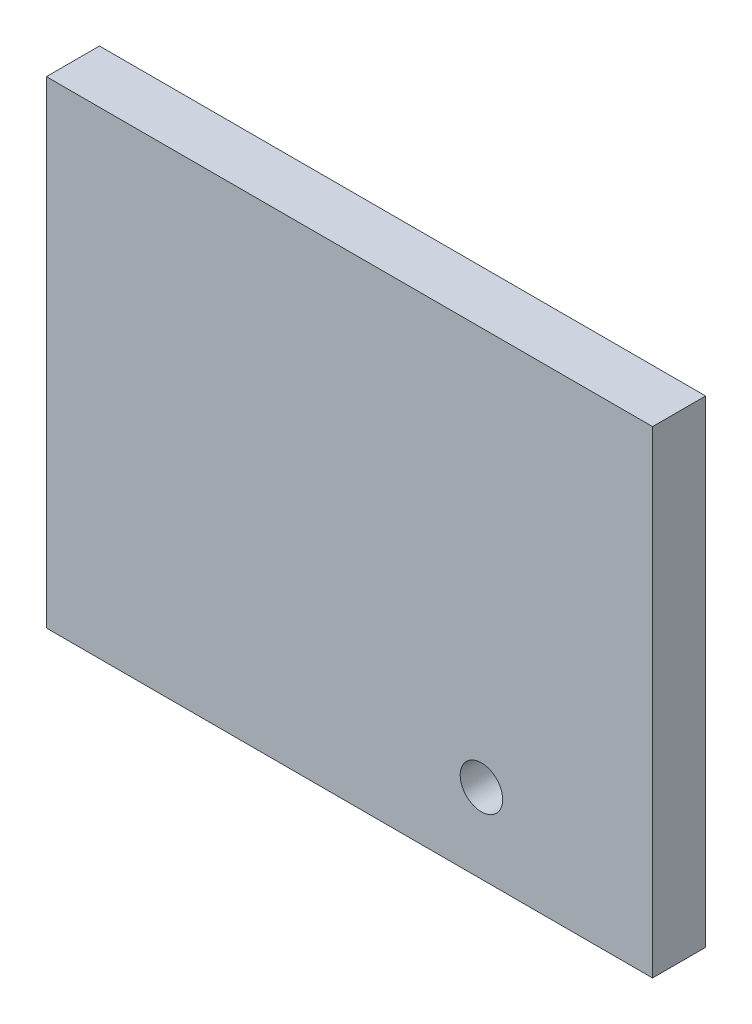
ISO-10303-21;
HEADER;
FILE_DESCRIPTION(('STEP AP214'),'2;1');
FILE_NAME('part.step','',(''),(''),'','','');
FILE_SCHEMA(('AUTOMOTIVE_DESIGN { 1 0 10303 214 1 1 1 1 }'));
ENDSEC;
DATA;
#1=APPLICATION_CONTEXT('core data for automotive mechanical design processes');
#2=APPLICATION_PROTOCOL_DEFINITION('international standard','automotive_design',2000,#1);
#3=PRODUCT_CONTEXT('',#1,'mechanical');
#4=PRODUCT('Part','Part','',(#3));
#5=PRODUCT_RELATED_PRODUCT_CATEGORY('part','',(#4));
#6=PRODUCT_DEFINITION_FORMATION('','',#4);
#7=PRODUCT_DEFINITION_CONTEXT('part definition',#1,'design');
#8=PRODUCT_DEFINITION('design','',#6,#7);
#9=PRODUCT_DEFINITION_SHAPE('','',#8);
#10=(LENGTH_UNIT() NAMED_UNIT(*) SI_UNIT(.MILLI.,.METRE.));
#11=(NAMED_UNIT(*) PLANE_ANGLE_UNIT() SI_UNIT($,.RADIAN.));
#12=(NAMED_UNIT(*) SI_UNIT($,.STERADIAN.) SOLID_ANGLE_UNIT());
#13=UNCERTAINTY_MEASURE_WITH_UNIT(LENGTH_MEASURE(1.E-05),#10,'distance_accuracy_value','');
#14=(GEOMETRIC_REPRESENTATION_CONTEXT(3) GLOBAL_UNCERTAINTY_ASSIGNED_CONTEXT((#13)) GLOBAL_UNIT_ASSIGNED_CONTEXT((#10,
#11,#12)) REPRESENTATION_CONTEXT('',''));
#15=CARTESIAN_POINT('',(0.,0.,0.));
#16=DIRECTION('',(0.,0.,1.));
#17=DIRECTION('',(1.,0.,0.));
#18=AXIS2_PLACEMENT_3D('',#15,#16,#17);
#19=CARTESIAN_POINT('',(57.12,-5.,10.));
#20=DIRECTION('',(-1.,0.,0.));
#21=DIRECTION('',(0.,0.,1.));
#22=AXIS2_PLACEMENT_3D('',#19,#20,#21);
#23=PLANE('',#22);
#24=DIRECTION('',(0.,1.,0.));
#25=VECTOR('',#24,1.);
#26=CARTESIAN_POINT('',(57.12,-5.,0.));
#27=LINE('',#26,#25);
#28=CARTESIAN_POINT('',(57.12,-5.,0.));
#29=VERTEX_POINT('',#28);
#30=CARTESIAN_POINT('',(57.12,85.,0.));
#31=VERTEX_POINT('',#30);
#32=EDGE_CURVE('E103',#29,#31,#27,.T.);
#33=ORIENTED_EDGE('',*,*,#32,.T.);
#34=DIRECTION('',(0.,0.,-1.));
#35=VECTOR('',#34,1.);
#36=CARTESIAN_POINT('',(57.12,85.,0.));
#37=LINE('',#36,#35);
#38=CARTESIAN_POINT('',(57.12,85.,10.));
#39=VERTEX_POINT('',#38);
#40=EDGE_CURVE('E90',#39,#31,#37,.T.);
#41=ORIENTED_EDGE('',*,*,#40,.F.);
#42=DIRECTION('',(0.,1.,0.));
#43=VECTOR('',#42,1.);
#44=CARTESIAN_POINT('',(57.12,-5.,10.));
#45=LINE('',#44,#43);
#46=CARTESIAN_POINT('',(57.12,-5.,10.));
#47=VERTEX_POINT('',#46);
#48=EDGE_CURVE('E81',#47,#39,#45,.T.);
#49=ORIENTED_EDGE('',*,*,#48,.F.);
#50=DIRECTION('',(0.,0.,-1.));
#51=VECTOR('',#50,1.);
#52=CARTESIAN_POINT('',(57.12,-5.,10.));
#53=LINE('',#52,#51);
#54=EDGE_CURVE('E43',#47,#29,#53,.T.);
#55=ORIENTED_EDGE('',*,*,#54,.T.);
#56=EDGE_LOOP('',(#33,#41,#49,#55));
#57=FACE_BOUND('',#56,.T.);
#58=ADVANCED_FACE('F35',(#57),#23,.F.);
#59=CARTESIAN_POINT('',(-57.12,-5.,10.));
#60=DIRECTION('',(1.,0.,0.));
#61=DIRECTION('',(0.,0.,-1.));
#62=AXIS2_PLACEMENT_3D('',#59,#60,#61);
#63=PLANE('',#62);
#64=DIRECTION('',(0.,-1.,0.));
#65=VECTOR('',#64,1.);
#66=CARTESIAN_POINT('',(-57.12,-5.,0.));
#67=LINE('',#66,#65);
#68=CARTESIAN_POINT('',(-57.12,85.,0.));
#69=VERTEX_POINT('',#68);
#70=CARTESIAN_POINT('',(-57.12,-5.,0.));
#71=VERTEX_POINT('',#70);
#72=EDGE_CURVE('E62',#69,#71,#67,.T.);
#73=ORIENTED_EDGE('',*,*,#72,.T.);
#74=DIRECTION('',(0.,0.,-1.));
#75=VECTOR('',#74,1.);
#76=CARTESIAN_POINT('',(-57.12,-5.,10.));
#77=LINE('',#76,#75);
#78=CARTESIAN_POINT('',(-57.12,-5.,10.));
#79=VERTEX_POINT('',#78);
#80=EDGE_CURVE('E11',#79,#71,#77,.T.);
#81=ORIENTED_EDGE('',*,*,#80,.F.);
#82=DIRECTION('',(0.,-1.,0.));
#83=VECTOR('',#82,1.);
#84=CARTESIAN_POINT('',(-57.12,-5.,10.));
#85=LINE('',#84,#83);
#86=CARTESIAN_POINT('',(-57.12,85.,10.));
#87=VERTEX_POINT('',#86);
#88=EDGE_CURVE('E76',#87,#79,#85,.T.);
#89=ORIENTED_EDGE('',*,*,#88,.F.);
#90=DIRECTION('',(0.,0.,1.));
#91=VECTOR('',#90,1.);
#92=CARTESIAN_POINT('',(-57.12,85.,0.));
#93=LINE('',#92,#91);
#94=EDGE_CURVE('E80',#69,#87,#93,.T.);
#95=ORIENTED_EDGE('',*,*,#94,.F.);
#96=EDGE_LOOP('',(#73,#81,#89,#95));
#97=FACE_BOUND('',#96,.T.);
#98=ADVANCED_FACE('F78',(#97),#63,.F.);
#99=CARTESIAN_POINT('',(-57.12,-5.,10.));
#100=DIRECTION('',(0.,1.,0.));
#101=DIRECTION('',(0.,0.,1.));
#102=AXIS2_PLACEMENT_3D('',#99,#100,#101);
#103=PLANE('',#102);
#104=DIRECTION('',(1.,0.,0.));
#105=VECTOR('',#104,1.);
#106=CARTESIAN_POINT('',(-57.12,-5.,0.));
#107=LINE('',#106,#105);
#108=EDGE_CURVE('E104',#71,#29,#107,.T.);
#109=ORIENTED_EDGE('',*,*,#108,.T.);
#110=ORIENTED_EDGE('',*,*,#54,.F.);
#111=DIRECTION('',(1.,0.,0.));
#112=VECTOR('',#111,1.);
#113=CARTESIAN_POINT('',(-57.12,-5.,10.));
#114=LINE('',#113,#112);
#115=EDGE_CURVE('E51',#79,#47,#114,.T.);
#116=ORIENTED_EDGE('',*,*,#115,.F.);
#117=ORIENTED_EDGE('',*,*,#80,.T.);
#118=EDGE_LOOP('',(#109,#110,#116,#117));
#119=FACE_BOUND('',#118,.T.);
#120=ADVANCED_FACE('F114',(#119),#103,.F.);
#121=CARTESIAN_POINT('',(0.,0.,10.));
#122=DIRECTION('',(0.,0.,-1.));
#123=DIRECTION('',(-1.,0.,0.));
#124=AXIS2_PLACEMENT_3D('',#121,#122,#123);
#125=PLANE('',#124);
#126=CARTESIAN_POINT('',(24.87,9.99,10.));
#127=DIRECTION('',(0.,0.,1.));
#128=DIRECTION('',(1.,0.,0.));
#129=AXIS2_PLACEMENT_3D('',#126,#127,#128);
#130=CIRCLE('',#129,4.00000000000001);
#131=CARTESIAN_POINT('',(28.87,9.99,10.));
#132=VERTEX_POINT('',#131);
#133=EDGE_CURVE('E97',#132,#132,#130,.T.);
#134=ORIENTED_EDGE('',*,*,#133,.F.);
#135=EDGE_LOOP('',(#134));
#136=FACE_BOUND('',#135,.T.);
#137=ORIENTED_EDGE('',*,*,#48,.T.);
#138=DIRECTION('',(1.,0.,0.));
#139=VECTOR('',#138,1.);
#140=CARTESIAN_POINT('',(-57.12,85.,10.));
#141=LINE('',#140,#139);
#142=EDGE_CURVE('E84',#87,#39,#141,.T.);
#143=ORIENTED_EDGE('',*,*,#142,.F.);
#144=ORIENTED_EDGE('',*,*,#88,.T.);
#145=ORIENTED_EDGE('',*,*,#115,.T.);
#146=EDGE_LOOP('',(#137,#143,#144,#145));
#147=FACE_BOUND('',#146,.T.);
#148=ADVANCED_FACE('F85',(#136,#147),#125,.F.);
#149=CARTESIAN_POINT('',(0.,0.,0.));
#150=DIRECTION('',(0.,0.,-1.));
#151=DIRECTION('',(-1.,0.,0.));
#152=AXIS2_PLACEMENT_3D('',#149,#150,#151);
#153=PLANE('',#152);
#154=CARTESIAN_POINT('',(24.87,9.99,0.));
#155=DIRECTION('',(0.,0.,1.));
#156=DIRECTION('',(1.,0.,0.));
#157=AXIS2_PLACEMENT_3D('',#154,#155,#156);
#158=CIRCLE('',#157,4.00000000000001);
#159=CARTESIAN_POINT('',(28.87,9.99,0.));
#160=VERTEX_POINT('',#159);
#161=EDGE_CURVE('E94',#160,#160,#158,.T.);
#162=ORIENTED_EDGE('',*,*,#161,.T.);
#163=EDGE_LOOP('',(#162));
#164=FACE_BOUND('',#163,.T.);
#165=ORIENTED_EDGE('',*,*,#32,.F.);
#166=ORIENTED_EDGE('',*,*,#108,.F.);
#167=ORIENTED_EDGE('',*,*,#72,.F.);
#168=DIRECTION('',(-1.,0.,0.));
#169=VECTOR('',#168,1.);
#170=CARTESIAN_POINT('',(-57.12,85.,0.));
#171=LINE('',#170,#169);
#172=EDGE_CURVE('E93',#31,#69,#171,.T.);
#173=ORIENTED_EDGE('',*,*,#172,.F.);
#174=EDGE_LOOP('',(#165,#166,#167,#173));
#175=FACE_BOUND('',#174,.T.);
#176=ADVANCED_FACE('F113',(#164,#175),#153,.T.);
#177=CARTESIAN_POINT('',(0.,85.,0.));
#178=DIRECTION('',(0.,1.,0.));
#179=DIRECTION('',(0.,0.,1.));
#180=AXIS2_PLACEMENT_3D('',#177,#178,#179);
#181=PLANE('',#180);
#182=ORIENTED_EDGE('',*,*,#94,.T.);
#183=ORIENTED_EDGE('',*,*,#142,.T.);
#184=ORIENTED_EDGE('',*,*,#40,.T.);
#185=ORIENTED_EDGE('',*,*,#172,.T.);
#186=EDGE_LOOP('',(#182,#183,#184,#185));
#187=FACE_BOUND('',#186,.T.);
#188=ADVANCED_FACE('F92',(#187),#181,.T.);
#189=CARTESIAN_POINT('',(24.87,9.99,0.));
#190=DIRECTION('',(0.,0.,1.));
#191=DIRECTION('',(1.,0.,0.));
#192=AXIS2_PLACEMENT_3D('',#189,#190,#191);
#193=CYLINDRICAL_SURFACE('',#192,4.00000000000001);
#194=ORIENTED_EDGE('',*,*,#161,.F.);
#195=EDGE_LOOP('',(#194));
#196=FACE_BOUND('',#195,.T.);
#197=ORIENTED_EDGE('',*,*,#133,.T.);
#198=EDGE_LOOP('',(#197));
#199=FACE_BOUND('',#198,.T.);
#200=ADVANCED_FACE('F142',(#196,#199),#193,.F.);
#201=CLOSED_SHELL('',(#58,#98,#120,#148,#176,#188,#200));
#202=MANIFOLD_SOLID_BREP('B2',#201);
#203=ADVANCED_BREP_SHAPE_REPRESENTATION('',(#18,#202),#14);
#204=SHAPE_DEFINITION_REPRESENTATION(#9,#203);
ENDSEC;
END-ISO-10303-21;
